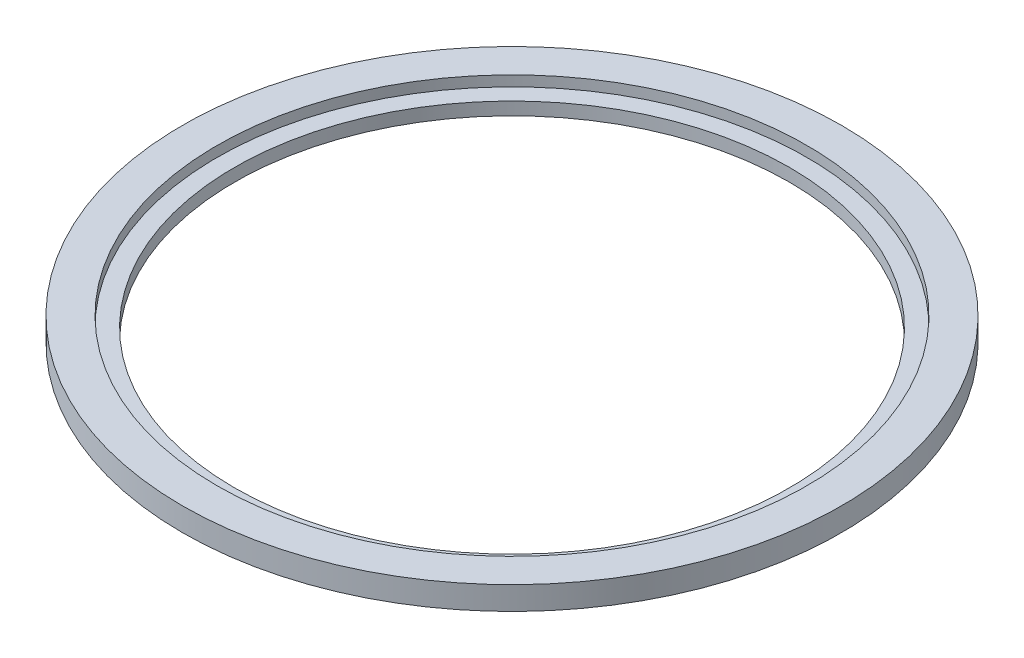
ISO-10303-21;
HEADER;
FILE_DESCRIPTION(('STEP AP214'),'2;1');
FILE_NAME('part.step','',(''),(''),'','','');
FILE_SCHEMA(('AUTOMOTIVE_DESIGN { 1 0 10303 214 1 1 1 1 }'));
ENDSEC;
DATA;
#1=APPLICATION_CONTEXT('core data for automotive mechanical design processes');
#2=APPLICATION_PROTOCOL_DEFINITION('international standard','automotive_design',2000,#1);
#3=PRODUCT_CONTEXT('',#1,'mechanical');
#4=PRODUCT('Part','Part','',(#3));
#5=PRODUCT_RELATED_PRODUCT_CATEGORY('part','',(#4));
#6=PRODUCT_DEFINITION_FORMATION('','',#4);
#7=PRODUCT_DEFINITION_CONTEXT('part definition',#1,'design');
#8=PRODUCT_DEFINITION('design','',#6,#7);
#9=PRODUCT_DEFINITION_SHAPE('','',#8);
#10=(LENGTH_UNIT() NAMED_UNIT(*) SI_UNIT(.MILLI.,.METRE.));
#11=(NAMED_UNIT(*) PLANE_ANGLE_UNIT() SI_UNIT($,.RADIAN.));
#12=(NAMED_UNIT(*) SI_UNIT($,.STERADIAN.) SOLID_ANGLE_UNIT());
#13=UNCERTAINTY_MEASURE_WITH_UNIT(LENGTH_MEASURE(1.E-05),#10,'distance_accuracy_value','');
#14=(GEOMETRIC_REPRESENTATION_CONTEXT(3) GLOBAL_UNCERTAINTY_ASSIGNED_CONTEXT((#13)) GLOBAL_UNIT_ASSIGNED_CONTEXT((#10,
#11,#12)) REPRESENTATION_CONTEXT('',''));
#15=CARTESIAN_POINT('',(0.,0.,0.));
#16=DIRECTION('',(0.,0.,1.));
#17=DIRECTION('',(1.,0.,0.));
#18=AXIS2_PLACEMENT_3D('',#15,#16,#17);
#19=CARTESIAN_POINT('',(0.,6.7,0.));
#20=DIRECTION('',(0.,-1.,0.));
#21=DIRECTION('',(0.,0.,-1.));
#22=AXIS2_PLACEMENT_3D('',#19,#20,#21);
#23=CYLINDRICAL_SURFACE('',#22,80.);
#24=CARTESIAN_POINT('',(0.,0.,0.));
#25=DIRECTION('',(0.,1.,0.));
#26=DIRECTION('',(0.,0.,1.));
#27=AXIS2_PLACEMENT_3D('',#24,#25,#26);
#28=CIRCLE('',#27,80.);
#29=CARTESIAN_POINT('',(0.,0.,80.));
#30=VERTEX_POINT('',#29);
#31=EDGE_CURVE('E43',#30,#30,#28,.T.);
#32=ORIENTED_EDGE('',*,*,#31,.F.);
#33=EDGE_LOOP('',(#32));
#34=FACE_BOUND('',#33,.T.);
#35=CARTESIAN_POINT('',(0.,3.7,0.));
#36=DIRECTION('',(0.,1.,0.));
#37=DIRECTION('',(0.,0.,1.));
#38=AXIS2_PLACEMENT_3D('',#35,#36,#37);
#39=CIRCLE('',#38,80.);
#40=CARTESIAN_POINT('',(0.,3.7,80.));
#41=VERTEX_POINT('',#40);
#42=EDGE_CURVE('E34',#41,#41,#39,.T.);
#43=ORIENTED_EDGE('',*,*,#42,.T.);
#44=EDGE_LOOP('',(#43));
#45=FACE_BOUND('',#44,.T.);
#46=ADVANCED_FACE('F30',(#34,#45),#23,.F.);
#47=CARTESIAN_POINT('',(0.,6.7,0.));
#48=DIRECTION('',(0.,1.,0.));
#49=DIRECTION('',(0.,0.,1.));
#50=AXIS2_PLACEMENT_3D('',#47,#48,#49);
#51=PLANE('',#50);
#52=CARTESIAN_POINT('',(0.,6.7,0.));
#53=DIRECTION('',(0.,1.,0.));
#54=DIRECTION('',(0.,0.,1.));
#55=AXIS2_PLACEMENT_3D('',#52,#53,#54);
#56=CIRCLE('',#55,85.);
#57=CARTESIAN_POINT('',(0.,6.7,85.));
#58=VERTEX_POINT('',#57);
#59=EDGE_CURVE('E47',#58,#58,#56,.T.);
#60=ORIENTED_EDGE('',*,*,#59,.F.);
#61=EDGE_LOOP('',(#60));
#62=FACE_BOUND('',#61,.T.);
#63=CARTESIAN_POINT('',(0.,6.7,0.));
#64=DIRECTION('',(0.,1.,0.));
#65=DIRECTION('',(0.,0.,1.));
#66=AXIS2_PLACEMENT_3D('',#63,#64,#65);
#67=CIRCLE('',#66,95.);
#68=CARTESIAN_POINT('',(0.,6.7,95.));
#69=VERTEX_POINT('',#68);
#70=EDGE_CURVE('E10',#69,#69,#67,.T.);
#71=ORIENTED_EDGE('',*,*,#70,.T.);
#72=EDGE_LOOP('',(#71));
#73=FACE_BOUND('',#72,.T.);
#74=ADVANCED_FACE('F68',(#62,#73),#51,.T.);
#75=CARTESIAN_POINT('',(0.,0.,0.));
#76=DIRECTION('',(0.,1.,0.));
#77=DIRECTION('',(0.,0.,1.));
#78=AXIS2_PLACEMENT_3D('',#75,#76,#77);
#79=PLANE('',#78);
#80=CARTESIAN_POINT('',(0.,0.,0.));
#81=DIRECTION('',(0.,1.,0.));
#82=DIRECTION('',(0.,0.,1.));
#83=AXIS2_PLACEMENT_3D('',#80,#81,#82);
#84=CIRCLE('',#83,95.);
#85=CARTESIAN_POINT('',(0.,0.,95.));
#86=VERTEX_POINT('',#85);
#87=EDGE_CURVE('E38',#86,#86,#84,.T.);
#88=ORIENTED_EDGE('',*,*,#87,.F.);
#89=EDGE_LOOP('',(#88));
#90=FACE_BOUND('',#89,.T.);
#91=ORIENTED_EDGE('',*,*,#31,.T.);
#92=EDGE_LOOP('',(#91));
#93=FACE_BOUND('',#92,.T.);
#94=ADVANCED_FACE('F75',(#90,#93),#79,.F.);
#95=CARTESIAN_POINT('',(0.,6.7,0.));
#96=DIRECTION('',(0.,-1.,0.));
#97=DIRECTION('',(0.,0.,-1.));
#98=AXIS2_PLACEMENT_3D('',#95,#96,#97);
#99=CYLINDRICAL_SURFACE('',#98,95.);
#100=ORIENTED_EDGE('',*,*,#70,.F.);
#101=EDGE_LOOP('',(#100));
#102=FACE_BOUND('',#101,.T.);
#103=ORIENTED_EDGE('',*,*,#87,.T.);
#104=EDGE_LOOP('',(#103));
#105=FACE_BOUND('',#104,.T.);
#106=ADVANCED_FACE('F32',(#102,#105),#99,.T.);
#107=CARTESIAN_POINT('',(0.,3.7,0.));
#108=DIRECTION('',(0.,1.,0.));
#109=DIRECTION('',(0.,0.,1.));
#110=AXIS2_PLACEMENT_3D('',#107,#108,#109);
#111=CYLINDRICAL_SURFACE('',#110,85.);
#112=CARTESIAN_POINT('',(0.,3.7,0.));
#113=DIRECTION('',(0.,1.,0.));
#114=DIRECTION('',(0.,0.,1.));
#115=AXIS2_PLACEMENT_3D('',#112,#113,#114);
#116=CIRCLE('',#115,85.);
#117=CARTESIAN_POINT('',(0.,3.7,85.));
#118=VERTEX_POINT('',#117);
#119=EDGE_CURVE('E50',#118,#118,#116,.T.);
#120=ORIENTED_EDGE('',*,*,#119,.F.);
#121=EDGE_LOOP('',(#120));
#122=FACE_BOUND('',#121,.T.);
#123=ORIENTED_EDGE('',*,*,#59,.T.);
#124=EDGE_LOOP('',(#123));
#125=FACE_BOUND('',#124,.T.);
#126=ADVANCED_FACE('F60',(#122,#125),#111,.F.);
#127=CARTESIAN_POINT('',(0.,3.7,0.));
#128=DIRECTION('',(0.,1.,0.));
#129=DIRECTION('',(0.,0.,1.));
#130=AXIS2_PLACEMENT_3D('',#127,#128,#129);
#131=PLANE('',#130);
#132=ORIENTED_EDGE('',*,*,#42,.F.);
#133=EDGE_LOOP('',(#132));
#134=FACE_BOUND('',#133,.T.);
#135=ORIENTED_EDGE('',*,*,#119,.T.);
#136=EDGE_LOOP('',(#135));
#137=FACE_BOUND('',#136,.T.);
#138=ADVANCED_FACE('F58',(#134,#137),#131,.T.);
#139=CLOSED_SHELL('',(#46,#74,#94,#106,#126,#138));
#140=MANIFOLD_SOLID_BREP('B2',#139);
#141=ADVANCED_BREP_SHAPE_REPRESENTATION('',(#18,#140),#14);
#142=SHAPE_DEFINITION_REPRESENTATION(#9,#141);
ENDSEC;
END-ISO-10303-21;
